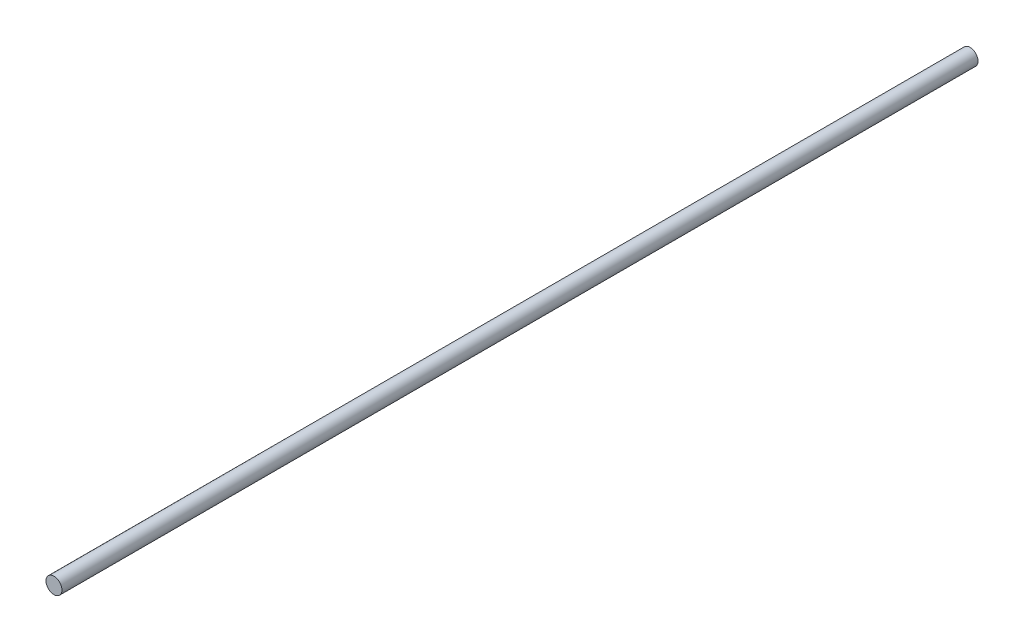
ISO-10303-21;
HEADER;
FILE_DESCRIPTION(('STEP AP214'),'2;1');
FILE_NAME('part.step','',(''),(''),'','','');
FILE_SCHEMA(('AUTOMOTIVE_DESIGN { 1 0 10303 214 1 1 1 1 }'));
ENDSEC;
DATA;
#1=APPLICATION_CONTEXT('core data for automotive mechanical design processes');
#2=APPLICATION_PROTOCOL_DEFINITION('international standard','automotive_design',2000,#1);
#3=PRODUCT_CONTEXT('',#1,'mechanical');
#4=PRODUCT('Part','Part','',(#3));
#5=PRODUCT_RELATED_PRODUCT_CATEGORY('part','',(#4));
#6=PRODUCT_DEFINITION_FORMATION('','',#4);
#7=PRODUCT_DEFINITION_CONTEXT('part definition',#1,'design');
#8=PRODUCT_DEFINITION('design','',#6,#7);
#9=PRODUCT_DEFINITION_SHAPE('','',#8);
#10=(LENGTH_UNIT() NAMED_UNIT(*) SI_UNIT(.MILLI.,.METRE.));
#11=(NAMED_UNIT(*) PLANE_ANGLE_UNIT() SI_UNIT($,.RADIAN.));
#12=(NAMED_UNIT(*) SI_UNIT($,.STERADIAN.) SOLID_ANGLE_UNIT());
#13=UNCERTAINTY_MEASURE_WITH_UNIT(LENGTH_MEASURE(1.E-05),#10,'distance_accuracy_value','');
#14=(GEOMETRIC_REPRESENTATION_CONTEXT(3) GLOBAL_UNCERTAINTY_ASSIGNED_CONTEXT((#13)) GLOBAL_UNIT_ASSIGNED_CONTEXT((#10,
#11,#12)) REPRESENTATION_CONTEXT('',''));
#15=CARTESIAN_POINT('',(0.,0.,0.));
#16=DIRECTION('',(0.,0.,1.));
#17=DIRECTION('',(1.,0.,0.));
#18=AXIS2_PLACEMENT_3D('',#15,#16,#17);
#19=CARTESIAN_POINT('',(0.,0.,574.));
#20=DIRECTION('',(0.,0.,-1.));
#21=DIRECTION('',(-1.,0.,0.));
#22=AXIS2_PLACEMENT_3D('',#19,#20,#21);
#23=CYLINDRICAL_SURFACE('',#22,5.);
#24=CARTESIAN_POINT('',(0.,0.,574.));
#25=DIRECTION('',(0.,0.,1.));
#26=DIRECTION('',(1.,0.,0.));
#27=AXIS2_PLACEMENT_3D('',#24,#25,#26);
#28=CIRCLE('',#27,5.);
#29=CARTESIAN_POINT('',(5.,0.,574.));
#30=VERTEX_POINT('',#29);
#31=EDGE_CURVE('E10',#30,#30,#28,.T.);
#32=ORIENTED_EDGE('',*,*,#31,.F.);
#33=EDGE_LOOP('',(#32));
#34=FACE_BOUND('',#33,.T.);
#35=CARTESIAN_POINT('',(0.,0.,0.));
#36=DIRECTION('',(0.,0.,1.));
#37=DIRECTION('',(1.,0.,0.));
#38=AXIS2_PLACEMENT_3D('',#35,#36,#37);
#39=CIRCLE('',#38,5.);
#40=CARTESIAN_POINT('',(5.,0.,0.));
#41=VERTEX_POINT('',#40);
#42=EDGE_CURVE('E38',#41,#41,#39,.T.);
#43=ORIENTED_EDGE('',*,*,#42,.T.);
#44=EDGE_LOOP('',(#43));
#45=FACE_BOUND('',#44,.T.);
#46=ADVANCED_FACE('F35',(#34,#45),#23,.T.);
#47=CARTESIAN_POINT('',(0.,0.,574.));
#48=DIRECTION('',(0.,0.,1.));
#49=DIRECTION('',(1.,0.,0.));
#50=AXIS2_PLACEMENT_3D('',#47,#48,#49);
#51=PLANE('',#50);
#52=ORIENTED_EDGE('',*,*,#31,.T.);
#53=EDGE_LOOP('',(#52));
#54=FACE_BOUND('',#53,.T.);
#55=ADVANCED_FACE('F50',(#54),#51,.T.);
#56=CARTESIAN_POINT('',(0.,0.,0.));
#57=DIRECTION('',(0.,0.,1.));
#58=DIRECTION('',(1.,0.,0.));
#59=AXIS2_PLACEMENT_3D('',#56,#57,#58);
#60=PLANE('',#59);
#61=ORIENTED_EDGE('',*,*,#42,.F.);
#62=EDGE_LOOP('',(#61));
#63=FACE_BOUND('',#62,.T.);
#64=ADVANCED_FACE('F48',(#63),#60,.F.);
#65=CLOSED_SHELL('',(#46,#55,#64));
#66=MANIFOLD_SOLID_BREP('B2',#65);
#67=ADVANCED_BREP_SHAPE_REPRESENTATION('',(#18,#66),#14);
#68=SHAPE_DEFINITION_REPRESENTATION(#9,#67);
ENDSEC;
END-ISO-10303-21;
